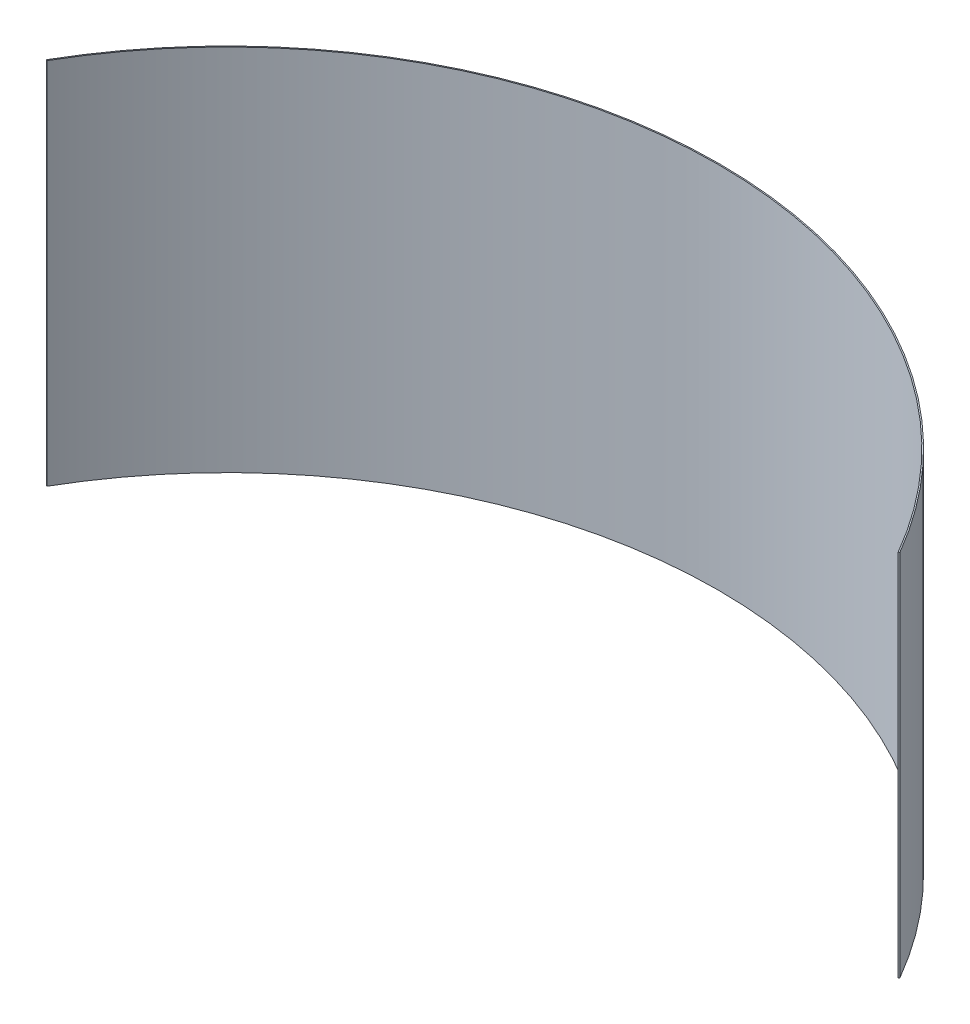
ISO-10303-21;
HEADER;
FILE_DESCRIPTION(('STEP AP214'),'2;1');
FILE_NAME('part.step','',(''),(''),'','','');
FILE_SCHEMA(('AUTOMOTIVE_DESIGN { 1 0 10303 214 1 1 1 1 }'));
ENDSEC;
DATA;
#1=APPLICATION_CONTEXT('core data for automotive mechanical design processes');
#2=APPLICATION_PROTOCOL_DEFINITION('international standard','automotive_design',2000,#1);
#3=PRODUCT_CONTEXT('',#1,'mechanical');
#4=PRODUCT('Part','Part','',(#3));
#5=PRODUCT_RELATED_PRODUCT_CATEGORY('part','',(#4));
#6=PRODUCT_DEFINITION_FORMATION('','',#4);
#7=PRODUCT_DEFINITION_CONTEXT('part definition',#1,'design');
#8=PRODUCT_DEFINITION('design','',#6,#7);
#9=PRODUCT_DEFINITION_SHAPE('','',#8);
#10=(LENGTH_UNIT() NAMED_UNIT(*) SI_UNIT(.MILLI.,.METRE.));
#11=(NAMED_UNIT(*) PLANE_ANGLE_UNIT() SI_UNIT($,.RADIAN.));
#12=(NAMED_UNIT(*) SI_UNIT($,.STERADIAN.) SOLID_ANGLE_UNIT());
#13=UNCERTAINTY_MEASURE_WITH_UNIT(LENGTH_MEASURE(1.E-05),#10,'distance_accuracy_value','');
#14=(GEOMETRIC_REPRESENTATION_CONTEXT(3) GLOBAL_UNCERTAINTY_ASSIGNED_CONTEXT((#13)) GLOBAL_UNIT_ASSIGNED_CONTEXT((#10,
#11,#12)) REPRESENTATION_CONTEXT('',''));
#15=CARTESIAN_POINT('',(0.,0.,0.));
#16=DIRECTION('',(0.,0.,1.));
#17=DIRECTION('',(1.,0.,0.));
#18=AXIS2_PLACEMENT_3D('',#15,#16,#17);
#19=CARTESIAN_POINT('',(0.,15.,0.));
#20=DIRECTION('',(0.,-1.,0.));
#21=DIRECTION('',(0.,0.,-1.));
#22=AXIS2_PLACEMENT_3D('',#19,#20,#21);
#23=CYLINDRICAL_SURFACE('',#22,20.);
#24=CARTESIAN_POINT('',(0.,0.,0.));
#25=DIRECTION('',(0.,-1.,0.));
#26=DIRECTION('',(0.,0.,1.));
#27=AXIS2_PLACEMENT_3D('',#24,#25,#26);
#28=CIRCLE('',#27,20.);
#29=CARTESIAN_POINT('',(-17.3205080756888,0.,-9.99999999999995));
#30=VERTEX_POINT('',#29);
#31=CARTESIAN_POINT('',(17.3205080756888,0.,-9.99999999999996));
#32=VERTEX_POINT('',#31);
#33=EDGE_CURVE('E97',#30,#32,#28,.T.);
#34=ORIENTED_EDGE('',*,*,#33,.T.);
#35=DIRECTION('',(0.,-1.,0.));
#36=VECTOR('',#35,1.);
#37=CARTESIAN_POINT('',(17.3205080756888,15.,-9.99999999999996));
#38=LINE('',#37,#36);
#39=CARTESIAN_POINT('',(17.3205080756888,15.,-9.99999999999996));
#40=VERTEX_POINT('',#39);
#41=EDGE_CURVE('E11',#40,#32,#38,.T.);
#42=ORIENTED_EDGE('',*,*,#41,.F.);
#43=CARTESIAN_POINT('',(0.,15.,0.));
#44=DIRECTION('',(0.,-1.,0.));
#45=DIRECTION('',(0.,0.,1.));
#46=AXIS2_PLACEMENT_3D('',#43,#44,#45);
#47=CIRCLE('',#46,20.);
#48=CARTESIAN_POINT('',(-17.3205080756888,15.,-9.99999999999995));
#49=VERTEX_POINT('',#48);
#50=EDGE_CURVE('E85',#49,#40,#47,.T.);
#51=ORIENTED_EDGE('',*,*,#50,.F.);
#52=DIRECTION('',(0.,-1.,0.));
#53=VECTOR('',#52,1.);
#54=CARTESIAN_POINT('',(-17.3205080756888,15.,-9.99999999999995));
#55=LINE('',#54,#53);
#56=EDGE_CURVE('E93',#49,#30,#55,.T.);
#57=ORIENTED_EDGE('',*,*,#56,.T.);
#58=EDGE_LOOP('',(#34,#42,#51,#57));
#59=FACE_BOUND('',#58,.T.);
#60=ADVANCED_FACE('F34',(#59),#23,.F.);
#61=CARTESIAN_POINT('',(17.3205080756888,15.,-9.99999999999996));
#62=DIRECTION('',(-0.500000000000017,0.,-0.866025403784429));
#63=DIRECTION('',(-0.866025403784429,0.,0.500000000000017));
#64=AXIS2_PLACEMENT_3D('',#61,#62,#63);
#65=PLANE('',#64);
#66=DIRECTION('',(0.866025403784429,0.,-0.500000000000017));
#67=VECTOR('',#66,1.);
#68=CARTESIAN_POINT('',(17.3205080756888,0.,-9.99999999999996));
#69=LINE('',#68,#67);
#70=CARTESIAN_POINT('',(17.363809345878,0.,-10.025));
#71=VERTEX_POINT('',#70);
#72=EDGE_CURVE('E89',#32,#71,#69,.T.);
#73=ORIENTED_EDGE('',*,*,#72,.T.);
#74=DIRECTION('',(0.,-1.,0.));
#75=VECTOR('',#74,1.);
#76=CARTESIAN_POINT('',(17.363809345878,15.,-10.025));
#77=LINE('',#76,#75);
#78=CARTESIAN_POINT('',(17.363809345878,15.,-10.025));
#79=VERTEX_POINT('',#78);
#80=EDGE_CURVE('E42',#79,#71,#77,.T.);
#81=ORIENTED_EDGE('',*,*,#80,.F.);
#82=DIRECTION('',(0.866025403784429,0.,-0.500000000000017));
#83=VECTOR('',#82,1.);
#84=CARTESIAN_POINT('',(17.3205080756888,15.,-9.99999999999996));
#85=LINE('',#84,#83);
#86=EDGE_CURVE('E80',#40,#79,#85,.T.);
#87=ORIENTED_EDGE('',*,*,#86,.F.);
#88=ORIENTED_EDGE('',*,*,#41,.T.);
#89=EDGE_LOOP('',(#73,#81,#87,#88));
#90=FACE_BOUND('',#89,.T.);
#91=ADVANCED_FACE('F88',(#90),#65,.F.);
#92=CARTESIAN_POINT('',(0.,15.,0.));
#93=DIRECTION('',(0.,-1.,0.));
#94=DIRECTION('',(0.,0.,-1.));
#95=AXIS2_PLACEMENT_3D('',#92,#93,#94);
#96=CYLINDRICAL_SURFACE('',#95,20.05);
#97=CARTESIAN_POINT('',(0.,0.,0.));
#98=DIRECTION('',(0.,1.,0.));
#99=DIRECTION('',(0.,0.,1.));
#100=AXIS2_PLACEMENT_3D('',#97,#98,#99);
#101=CIRCLE('',#100,20.05);
#102=CARTESIAN_POINT('',(-17.363809345878,0.,-10.025));
#103=VERTEX_POINT('',#102);
#104=EDGE_CURVE('E67',#71,#103,#101,.T.);
#105=ORIENTED_EDGE('',*,*,#104,.T.);
#106=DIRECTION('',(0.,-1.,0.));
#107=VECTOR('',#106,1.);
#108=CARTESIAN_POINT('',(-17.363809345878,15.,-10.025));
#109=LINE('',#108,#107);
#110=CARTESIAN_POINT('',(-17.363809345878,15.,-10.025));
#111=VERTEX_POINT('',#110);
#112=EDGE_CURVE('E90',#111,#103,#109,.T.);
#113=ORIENTED_EDGE('',*,*,#112,.F.);
#114=CARTESIAN_POINT('',(0.,15.,0.));
#115=DIRECTION('',(0.,1.,0.));
#116=DIRECTION('',(0.,0.,1.));
#117=AXIS2_PLACEMENT_3D('',#114,#115,#116);
#118=CIRCLE('',#117,20.05);
#119=EDGE_CURVE('E83',#79,#111,#118,.T.);
#120=ORIENTED_EDGE('',*,*,#119,.F.);
#121=ORIENTED_EDGE('',*,*,#80,.T.);
#122=EDGE_LOOP('',(#105,#113,#120,#121));
#123=FACE_BOUND('',#122,.T.);
#124=ADVANCED_FACE('F91',(#123),#96,.T.);
#125=CARTESIAN_POINT('',(-17.3205080756888,15.,-9.99999999999995));
#126=DIRECTION('',(0.499999999999991,0.,-0.866025403784444));
#127=DIRECTION('',(-0.866025403784444,0.,-0.499999999999991));
#128=AXIS2_PLACEMENT_3D('',#125,#126,#127);
#129=PLANE('',#128);
#130=DIRECTION('',(0.866025403784444,0.,0.499999999999991));
#131=VECTOR('',#130,1.);
#132=CARTESIAN_POINT('',(-17.3205080756888,0.,-9.99999999999995));
#133=LINE('',#132,#131);
#134=EDGE_CURVE('E73',#103,#30,#133,.T.);
#135=ORIENTED_EDGE('',*,*,#134,.T.);
#136=ORIENTED_EDGE('',*,*,#56,.F.);
#137=DIRECTION('',(0.866025403784444,0.,0.499999999999991));
#138=VECTOR('',#137,1.);
#139=CARTESIAN_POINT('',(-17.3205080756888,15.,-9.99999999999995));
#140=LINE('',#139,#138);
#141=EDGE_CURVE('E50',#111,#49,#140,.T.);
#142=ORIENTED_EDGE('',*,*,#141,.F.);
#143=ORIENTED_EDGE('',*,*,#112,.T.);
#144=EDGE_LOOP('',(#135,#136,#142,#143));
#145=FACE_BOUND('',#144,.T.);
#146=ADVANCED_FACE('F104',(#145),#129,.F.);
#147=CARTESIAN_POINT('',(0.,15.,0.));
#148=DIRECTION('',(0.,1.,0.));
#149=DIRECTION('',(0.,0.,1.));
#150=AXIS2_PLACEMENT_3D('',#147,#148,#149);
#151=PLANE('',#150);
#152=ORIENTED_EDGE('',*,*,#50,.T.);
#153=ORIENTED_EDGE('',*,*,#86,.T.);
#154=ORIENTED_EDGE('',*,*,#119,.T.);
#155=ORIENTED_EDGE('',*,*,#141,.T.);
#156=EDGE_LOOP('',(#152,#153,#154,#155));
#157=FACE_BOUND('',#156,.T.);
#158=ADVANCED_FACE('F81',(#157),#151,.T.);
#159=CARTESIAN_POINT('',(0.,0.,0.));
#160=DIRECTION('',(0.,1.,0.));
#161=DIRECTION('',(0.,0.,1.));
#162=AXIS2_PLACEMENT_3D('',#159,#160,#161);
#163=PLANE('',#162);
#164=ORIENTED_EDGE('',*,*,#33,.F.);
#165=ORIENTED_EDGE('',*,*,#134,.F.);
#166=ORIENTED_EDGE('',*,*,#104,.F.);
#167=ORIENTED_EDGE('',*,*,#72,.F.);
#168=EDGE_LOOP('',(#164,#165,#166,#167));
#169=FACE_BOUND('',#168,.T.);
#170=ADVANCED_FACE('F107',(#169),#163,.F.);
#171=CLOSED_SHELL('',(#60,#91,#124,#146,#158,#170));
#172=MANIFOLD_SOLID_BREP('B2',#171);
#173=ADVANCED_BREP_SHAPE_REPRESENTATION('',(#18,#172),#14);
#174=SHAPE_DEFINITION_REPRESENTATION(#9,#173);
ENDSEC;
END-ISO-10303-21;
